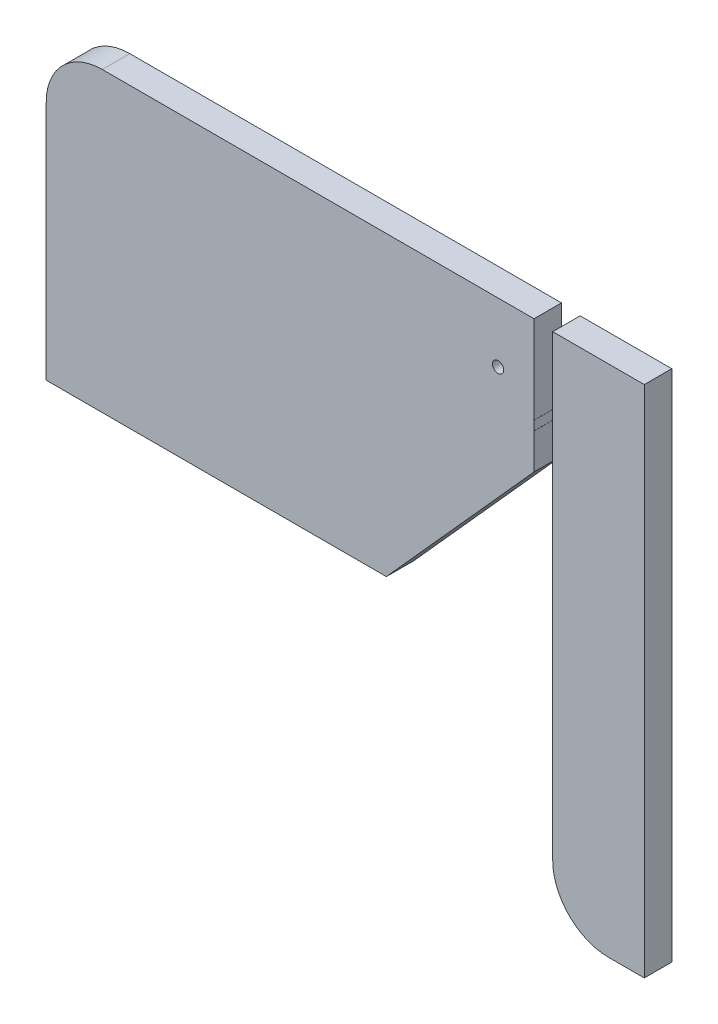
ISO-10303-21;
HEADER;
FILE_DESCRIPTION(('STEP AP214'),'2;1');
FILE_NAME('part.step','',(''),(''),'','','');
FILE_SCHEMA(('AUTOMOTIVE_DESIGN { 1 0 10303 214 1 1 1 1 }'));
ENDSEC;
DATA;
#1=APPLICATION_CONTEXT('core data for automotive mechanical design processes');
#2=APPLICATION_PROTOCOL_DEFINITION('international standard','automotive_design',2000,#1);
#3=PRODUCT_CONTEXT('',#1,'mechanical');
#4=PRODUCT('Part','Part','',(#3));
#5=PRODUCT_RELATED_PRODUCT_CATEGORY('part','',(#4));
#6=PRODUCT_DEFINITION_FORMATION('','',#4);
#7=PRODUCT_DEFINITION_CONTEXT('part definition',#1,'design');
#8=PRODUCT_DEFINITION('design','',#6,#7);
#9=PRODUCT_DEFINITION_SHAPE('','',#8);
#10=(LENGTH_UNIT() NAMED_UNIT(*) SI_UNIT(.MILLI.,.METRE.));
#11=(NAMED_UNIT(*) PLANE_ANGLE_UNIT() SI_UNIT($,.RADIAN.));
#12=(NAMED_UNIT(*) SI_UNIT($,.STERADIAN.) SOLID_ANGLE_UNIT());
#13=UNCERTAINTY_MEASURE_WITH_UNIT(LENGTH_MEASURE(1.E-05),#10,'distance_accuracy_value','');
#14=(GEOMETRIC_REPRESENTATION_CONTEXT(3) GLOBAL_UNCERTAINTY_ASSIGNED_CONTEXT((#13)) GLOBAL_UNIT_ASSIGNED_CONTEXT((#10,
#11,#12)) REPRESENTATION_CONTEXT('',''));
#15=CARTESIAN_POINT('',(0.,0.,0.));
#16=DIRECTION('',(0.,0.,1.));
#17=DIRECTION('',(1.,0.,0.));
#18=AXIS2_PLACEMENT_3D('',#15,#16,#17);
#19=CARTESIAN_POINT('',(27.4,24.1,1.47));
#20=DIRECTION('',(0.,0.,-1.));
#21=DIRECTION('',(-1.,0.,0.));
#22=AXIS2_PLACEMENT_3D('',#19,#20,#21);
#23=CYLINDRICAL_SURFACE('',#22,0.00249999999999903);
#24=CARTESIAN_POINT('',(27.4,24.1,0.));
#25=DIRECTION('',(0.,0.,1.));
#26=DIRECTION('',(1.,0.,0.));
#27=AXIS2_PLACEMENT_3D('',#24,#25,#26);
#28=CIRCLE('',#27,0.00249999999999903);
#29=CARTESIAN_POINT('',(27.4,24.0975,0.));
#30=VERTEX_POINT('',#29);
#31=CARTESIAN_POINT('',(27.4,24.1025,0.));
#32=VERTEX_POINT('',#31);
#33=EDGE_CURVE('E144',#30,#32,#28,.T.);
#34=ORIENTED_EDGE('',*,*,#33,.F.);
#35=DIRECTION('',(0.,0.,-1.));
#36=VECTOR('',#35,1.);
#37=CARTESIAN_POINT('',(27.4,24.0975,1.47));
#38=LINE('',#37,#36);
#39=CARTESIAN_POINT('',(27.4,24.0975,1.47));
#40=VERTEX_POINT('',#39);
#41=EDGE_CURVE('E12',#40,#30,#38,.T.);
#42=ORIENTED_EDGE('',*,*,#41,.F.);
#43=CARTESIAN_POINT('',(27.4,24.1,1.47));
#44=DIRECTION('',(0.,0.,1.));
#45=DIRECTION('',(1.,0.,0.));
#46=AXIS2_PLACEMENT_3D('',#43,#44,#45);
#47=CIRCLE('',#46,0.00249999999999903);
#48=CARTESIAN_POINT('',(27.4,24.1025,1.47));
#49=VERTEX_POINT('',#48);
#50=EDGE_CURVE('E200',#40,#49,#47,.T.);
#51=ORIENTED_EDGE('',*,*,#50,.T.);
#52=DIRECTION('',(0.,0.,-1.));
#53=VECTOR('',#52,1.);
#54=CARTESIAN_POINT('',(27.4,24.1025,1.47));
#55=LINE('',#54,#53);
#56=EDGE_CURVE('E97',#49,#32,#55,.T.);
#57=ORIENTED_EDGE('',*,*,#56,.T.);
#58=EDGE_LOOP('',(#34,#42,#51,#57));
#59=FACE_BOUND('',#58,.T.);
#60=ADVANCED_FACE('F44',(#59),#23,.F.);
#61=CARTESIAN_POINT('',(27.4,0.,1.47));
#62=DIRECTION('',(1.,0.,0.));
#63=DIRECTION('',(0.,0.,-1.));
#64=AXIS2_PLACEMENT_3D('',#61,#62,#63);
#65=PLANE('',#64);
#66=DIRECTION('',(0.,-1.,0.));
#67=VECTOR('',#66,1.);
#68=CARTESIAN_POINT('',(27.4,0.,0.));
#69=LINE('',#68,#67);
#70=CARTESIAN_POINT('',(27.4,4.7,0.));
#71=VERTEX_POINT('',#70);
#72=EDGE_CURVE('E147',#30,#71,#69,.T.);
#73=ORIENTED_EDGE('',*,*,#72,.T.);
#74=DIRECTION('',(0.,0.,-1.));
#75=VECTOR('',#74,1.);
#76=CARTESIAN_POINT('',(27.4,4.7,1.47));
#77=LINE('',#76,#75);
#78=CARTESIAN_POINT('',(27.4,4.7,1.47));
#79=VERTEX_POINT('',#78);
#80=EDGE_CURVE('E52',#79,#71,#77,.T.);
#81=ORIENTED_EDGE('',*,*,#80,.F.);
#82=DIRECTION('',(0.,-1.,0.));
#83=VECTOR('',#82,1.);
#84=CARTESIAN_POINT('',(27.4,0.,1.47));
#85=LINE('',#84,#83);
#86=EDGE_CURVE('E196',#40,#79,#85,.T.);
#87=ORIENTED_EDGE('',*,*,#86,.F.);
#88=ORIENTED_EDGE('',*,*,#41,.T.);
#89=EDGE_LOOP('',(#73,#81,#87,#88));
#90=FACE_BOUND('',#89,.T.);
#91=ADVANCED_FACE('F203',(#90),#65,.F.);
#92=CARTESIAN_POINT('',(30.4,4.7,1.47));
#93=DIRECTION('',(0.,0.,-1.));
#94=DIRECTION('',(-1.,0.,0.));
#95=AXIS2_PLACEMENT_3D('',#92,#93,#94);
#96=CYLINDRICAL_SURFACE('',#95,3.);
#97=CARTESIAN_POINT('',(30.4,4.7,0.));
#98=DIRECTION('',(0.,0.,1.));
#99=DIRECTION('',(1.,0.,0.));
#100=AXIS2_PLACEMENT_3D('',#97,#98,#99);
#101=CIRCLE('',#100,3.);
#102=CARTESIAN_POINT('',(30.4,1.7,0.));
#103=VERTEX_POINT('',#102);
#104=EDGE_CURVE('E149',#71,#103,#101,.T.);
#105=ORIENTED_EDGE('',*,*,#104,.T.);
#106=DIRECTION('',(0.,0.,-1.));
#107=VECTOR('',#106,1.);
#108=CARTESIAN_POINT('',(30.4,1.7,1.47));
#109=LINE('',#108,#107);
#110=CARTESIAN_POINT('',(30.4,1.7,1.47));
#111=VERTEX_POINT('',#110);
#112=EDGE_CURVE('E170',#111,#103,#109,.T.);
#113=ORIENTED_EDGE('',*,*,#112,.F.);
#114=CARTESIAN_POINT('',(30.4,4.7,1.47));
#115=DIRECTION('',(0.,0.,1.));
#116=DIRECTION('',(1.,0.,0.));
#117=AXIS2_PLACEMENT_3D('',#114,#115,#116);
#118=CIRCLE('',#117,3.);
#119=EDGE_CURVE('E179',#79,#111,#118,.T.);
#120=ORIENTED_EDGE('',*,*,#119,.F.);
#121=ORIENTED_EDGE('',*,*,#80,.T.);
#122=EDGE_LOOP('',(#105,#113,#120,#121));
#123=FACE_BOUND('',#122,.T.);
#124=ADVANCED_FACE('F177',(#123),#96,.T.);
#125=CARTESIAN_POINT('',(0.,1.7,1.47));
#126=DIRECTION('',(0.,1.,0.));
#127=DIRECTION('',(0.,0.,1.));
#128=AXIS2_PLACEMENT_3D('',#125,#126,#127);
#129=PLANE('',#128);
#130=DIRECTION('',(1.,0.,0.));
#131=VECTOR('',#130,1.);
#132=CARTESIAN_POINT('',(0.,1.7,0.));
#133=LINE('',#132,#131);
#134=CARTESIAN_POINT('',(32.3,1.7,0.));
#135=VERTEX_POINT('',#134);
#136=EDGE_CURVE('E151',#103,#135,#133,.T.);
#137=ORIENTED_EDGE('',*,*,#136,.T.);
#138=DIRECTION('',(0.,0.,-1.));
#139=VECTOR('',#138,1.);
#140=CARTESIAN_POINT('',(32.3,1.7,1.47));
#141=LINE('',#140,#139);
#142=CARTESIAN_POINT('',(32.3,1.7,1.47));
#143=VERTEX_POINT('',#142);
#144=EDGE_CURVE('E168',#143,#135,#141,.T.);
#145=ORIENTED_EDGE('',*,*,#144,.F.);
#146=DIRECTION('',(1.,0.,0.));
#147=VECTOR('',#146,1.);
#148=CARTESIAN_POINT('',(0.,1.7,1.47));
#149=LINE('',#148,#147);
#150=EDGE_CURVE('E192',#111,#143,#149,.T.);
#151=ORIENTED_EDGE('',*,*,#150,.F.);
#152=ORIENTED_EDGE('',*,*,#112,.T.);
#153=EDGE_LOOP('',(#137,#145,#151,#152));
#154=FACE_BOUND('',#153,.T.);
#155=ADVANCED_FACE('F189',(#154),#129,.F.);
#156=CARTESIAN_POINT('',(32.3,0.,1.47));
#157=DIRECTION('',(1.,0.,0.));
#158=DIRECTION('',(0.,0.,-1.));
#159=AXIS2_PLACEMENT_3D('',#156,#157,#158);
#160=PLANE('',#159);
#161=DIRECTION('',(0.,-1.,0.));
#162=VECTOR('',#161,1.);
#163=CARTESIAN_POINT('',(32.3,0.,0.));
#164=LINE('',#163,#162);
#165=CARTESIAN_POINT('',(32.3,29.2,0.));
#166=VERTEX_POINT('',#165);
#167=EDGE_CURVE('E154',#166,#135,#164,.T.);
#168=ORIENTED_EDGE('',*,*,#167,.F.);
#169=DIRECTION('',(0.,0.,-1.));
#170=VECTOR('',#169,1.);
#171=CARTESIAN_POINT('',(32.3,29.2,1.47));
#172=LINE('',#171,#170);
#173=CARTESIAN_POINT('',(32.3,29.2,1.47));
#174=VERTEX_POINT('',#173);
#175=EDGE_CURVE('E166',#174,#166,#172,.T.);
#176=ORIENTED_EDGE('',*,*,#175,.F.);
#177=DIRECTION('',(0.,-1.,0.));
#178=VECTOR('',#177,1.);
#179=CARTESIAN_POINT('',(32.3,0.,1.47));
#180=LINE('',#179,#178);
#181=EDGE_CURVE('E193',#174,#143,#180,.T.);
#182=ORIENTED_EDGE('',*,*,#181,.T.);
#183=ORIENTED_EDGE('',*,*,#144,.T.);
#184=EDGE_LOOP('',(#168,#176,#182,#183));
#185=FACE_BOUND('',#184,.T.);
#186=ADVANCED_FACE('F214',(#185),#160,.T.);
#187=CARTESIAN_POINT('',(0.,29.2,1.47));
#188=DIRECTION('',(0.,-1.,0.));
#189=DIRECTION('',(0.,0.,-1.));
#190=AXIS2_PLACEMENT_3D('',#187,#188,#189);
#191=PLANE('',#190);
#192=DIRECTION('',(-1.,0.,0.));
#193=VECTOR('',#192,1.);
#194=CARTESIAN_POINT('',(0.,29.2,0.));
#195=LINE('',#194,#193);
#196=CARTESIAN_POINT('',(27.4,29.2,0.));
#197=VERTEX_POINT('',#196);
#198=EDGE_CURVE('E157',#166,#197,#195,.T.);
#199=ORIENTED_EDGE('',*,*,#198,.T.);
#200=DIRECTION('',(0.,0.,-1.));
#201=VECTOR('',#200,1.);
#202=CARTESIAN_POINT('',(27.4,29.2,1.47));
#203=LINE('',#202,#201);
#204=CARTESIAN_POINT('',(27.4,29.2,1.47));
#205=VERTEX_POINT('',#204);
#206=EDGE_CURVE('E138',#205,#197,#203,.T.);
#207=ORIENTED_EDGE('',*,*,#206,.F.);
#208=DIRECTION('',(-1.,0.,0.));
#209=VECTOR('',#208,1.);
#210=CARTESIAN_POINT('',(0.,29.2,1.47));
#211=LINE('',#210,#209);
#212=EDGE_CURVE('E125',#174,#205,#211,.T.);
#213=ORIENTED_EDGE('',*,*,#212,.F.);
#214=ORIENTED_EDGE('',*,*,#175,.T.);
#215=EDGE_LOOP('',(#199,#207,#213,#214));
#216=FACE_BOUND('',#215,.T.);
#217=ADVANCED_FACE('F217',(#216),#191,.F.);
#218=CARTESIAN_POINT('',(27.4,0.,1.47));
#219=DIRECTION('',(1.,0.,0.));
#220=DIRECTION('',(0.,0.,-1.));
#221=AXIS2_PLACEMENT_3D('',#218,#219,#220);
#222=PLANE('',#221);
#223=DIRECTION('',(0.,-1.,0.));
#224=VECTOR('',#223,1.);
#225=CARTESIAN_POINT('',(27.4,0.,0.));
#226=LINE('',#225,#224);
#227=CARTESIAN_POINT('',(27.4,24.6025,0.));
#228=VERTEX_POINT('',#227);
#229=EDGE_CURVE('E134',#197,#228,#226,.T.);
#230=ORIENTED_EDGE('',*,*,#229,.T.);
#231=DIRECTION('',(0.,0.,-1.));
#232=VECTOR('',#231,1.);
#233=CARTESIAN_POINT('',(27.4,24.6025,1.47));
#234=LINE('',#233,#232);
#235=CARTESIAN_POINT('',(27.4,24.6025,1.47));
#236=VERTEX_POINT('',#235);
#237=EDGE_CURVE('E131',#236,#228,#234,.T.);
#238=ORIENTED_EDGE('',*,*,#237,.F.);
#239=DIRECTION('',(0.,-1.,0.));
#240=VECTOR('',#239,1.);
#241=CARTESIAN_POINT('',(27.4,0.,1.47));
#242=LINE('',#241,#240);
#243=EDGE_CURVE('E118',#205,#236,#242,.T.);
#244=ORIENTED_EDGE('',*,*,#243,.F.);
#245=ORIENTED_EDGE('',*,*,#206,.T.);
#246=EDGE_LOOP('',(#230,#238,#244,#245));
#247=FACE_BOUND('',#246,.T.);
#248=ADVANCED_FACE('F132',(#247),#222,.F.);
#249=CARTESIAN_POINT('',(27.4,24.6,1.47));
#250=DIRECTION('',(0.,0.,-1.));
#251=DIRECTION('',(-1.,0.,0.));
#252=AXIS2_PLACEMENT_3D('',#249,#250,#251);
#253=CYLINDRICAL_SURFACE('',#252,0.00249999999999903);
#254=CARTESIAN_POINT('',(27.4,24.6,0.));
#255=DIRECTION('',(0.,0.,1.));
#256=DIRECTION('',(1.,0.,0.));
#257=AXIS2_PLACEMENT_3D('',#254,#255,#256);
#258=CIRCLE('',#257,0.00249999999999903);
#259=CARTESIAN_POINT('',(27.4,24.5975,0.));
#260=VERTEX_POINT('',#259);
#261=EDGE_CURVE('E160',#260,#228,#258,.T.);
#262=ORIENTED_EDGE('',*,*,#261,.F.);
#263=DIRECTION('',(0.,0.,-1.));
#264=VECTOR('',#263,1.);
#265=CARTESIAN_POINT('',(27.4,24.5975,1.47));
#266=LINE('',#265,#264);
#267=CARTESIAN_POINT('',(27.4,24.5975,1.47));
#268=VERTEX_POINT('',#267);
#269=EDGE_CURVE('E90',#268,#260,#266,.T.);
#270=ORIENTED_EDGE('',*,*,#269,.F.);
#271=CARTESIAN_POINT('',(27.4,24.6,1.47));
#272=DIRECTION('',(0.,0.,1.));
#273=DIRECTION('',(1.,0.,0.));
#274=AXIS2_PLACEMENT_3D('',#271,#272,#273);
#275=CIRCLE('',#274,0.00249999999999903);
#276=EDGE_CURVE('E122',#268,#236,#275,.T.);
#277=ORIENTED_EDGE('',*,*,#276,.T.);
#278=ORIENTED_EDGE('',*,*,#237,.T.);
#279=EDGE_LOOP('',(#262,#270,#277,#278));
#280=FACE_BOUND('',#279,.T.);
#281=ADVANCED_FACE('F140',(#280),#253,.F.);
#282=EDGE_CURVE('E161',#260,#32,#226,.T.);
#283=ORIENTED_EDGE('',*,*,#282,.T.);
#284=ORIENTED_EDGE('',*,*,#56,.F.);
#285=EDGE_CURVE('E60',#268,#49,#242,.T.);
#286=ORIENTED_EDGE('',*,*,#285,.F.);
#287=ORIENTED_EDGE('',*,*,#269,.T.);
#288=EDGE_LOOP('',(#283,#284,#286,#287));
#289=FACE_BOUND('',#288,.T.);
#290=ADVANCED_FACE('F201',(#289),#222,.F.);
#291=CARTESIAN_POINT('',(0.,0.,1.47));
#292=DIRECTION('',(0.,0.,1.));
#293=DIRECTION('',(1.,0.,0.));
#294=AXIS2_PLACEMENT_3D('',#291,#292,#293);
#295=PLANE('',#294);
#296=ORIENTED_EDGE('',*,*,#50,.F.);
#297=ORIENTED_EDGE('',*,*,#86,.T.);
#298=ORIENTED_EDGE('',*,*,#119,.T.);
#299=ORIENTED_EDGE('',*,*,#150,.T.);
#300=ORIENTED_EDGE('',*,*,#181,.F.);
#301=ORIENTED_EDGE('',*,*,#212,.T.);
#302=ORIENTED_EDGE('',*,*,#243,.T.);
#303=ORIENTED_EDGE('',*,*,#276,.F.);
#304=ORIENTED_EDGE('',*,*,#285,.T.);
#305=EDGE_LOOP('',(#296,#297,#298,#299,#300,#301,#302,#303,#304));
#306=FACE_BOUND('',#305,.T.);
#307=ADVANCED_FACE('F120',(#306),#295,.T.);
#308=CARTESIAN_POINT('',(0.,0.,0.));
#309=DIRECTION('',(0.,0.,1.));
#310=DIRECTION('',(1.,0.,0.));
#311=AXIS2_PLACEMENT_3D('',#308,#309,#310);
#312=PLANE('',#311);
#313=ORIENTED_EDGE('',*,*,#33,.T.);
#314=ORIENTED_EDGE('',*,*,#282,.F.);
#315=ORIENTED_EDGE('',*,*,#261,.T.);
#316=ORIENTED_EDGE('',*,*,#229,.F.);
#317=ORIENTED_EDGE('',*,*,#198,.F.);
#318=ORIENTED_EDGE('',*,*,#167,.T.);
#319=ORIENTED_EDGE('',*,*,#136,.F.);
#320=ORIENTED_EDGE('',*,*,#104,.F.);
#321=ORIENTED_EDGE('',*,*,#72,.F.);
#322=EDGE_LOOP('',(#313,#314,#315,#316,#317,#318,#319,#320,#321));
#323=FACE_BOUND('',#322,.T.);
#324=ADVANCED_FACE('F184',(#323),#312,.F.);
#325=CLOSED_SHELL('',(#60,#91,#124,#155,#186,#217,#248,#281,#290,#307,#324));
#326=MANIFOLD_SOLID_BREP('B2',#325);
#327=CARTESIAN_POINT('',(17.69985,13.4,1.47));
#328=DIRECTION('',(0.,0.,-1.));
#329=DIRECTION('',(-1.,0.,0.));
#330=AXIS2_PLACEMENT_3D('',#327,#328,#329);
#331=CYLINDRICAL_SURFACE('',#330,0.000150000000000844);
#332=CARTESIAN_POINT('',(17.69985,13.4,0.));
#333=DIRECTION('',(0.,0.,1.));
#334=DIRECTION('',(1.,0.,0.));
#335=AXIS2_PLACEMENT_3D('',#332,#333,#334);
#336=CIRCLE('',#335,0.000150000000000844);
#337=CARTESIAN_POINT('',(17.7,13.4,0.));
#338=VERTEX_POINT('',#337);
#339=CARTESIAN_POINT('',(17.6997,13.4,0.));
#340=VERTEX_POINT('',#339);
#341=EDGE_CURVE('E429',#338,#340,#336,.T.);
#342=ORIENTED_EDGE('',*,*,#341,.F.);
#343=DIRECTION('',(0.,0.,-1.));
#344=VECTOR('',#343,1.);
#345=CARTESIAN_POINT('',(17.7,13.4,1.47));
#346=LINE('',#345,#344);
#347=CARTESIAN_POINT('',(17.7,13.4,1.47));
#348=VERTEX_POINT('',#347);
#349=EDGE_CURVE('E42',#348,#338,#346,.T.);
#350=ORIENTED_EDGE('',*,*,#349,.F.);
#351=CARTESIAN_POINT('',(17.69985,13.4,1.47));
#352=DIRECTION('',(0.,0.,1.));
#353=DIRECTION('',(1.,0.,0.));
#354=AXIS2_PLACEMENT_3D('',#351,#352,#353);
#355=CIRCLE('',#354,0.000150000000000844);
#356=CARTESIAN_POINT('',(17.6997,13.4,1.47));
#357=VERTEX_POINT('',#356);
#358=EDGE_CURVE('E467',#348,#357,#355,.T.);
#359=ORIENTED_EDGE('',*,*,#358,.T.);
#360=DIRECTION('',(0.,0.,-1.));
#361=VECTOR('',#360,1.);
#362=CARTESIAN_POINT('',(17.6997,13.4,1.47));
#363=LINE('',#362,#361);
#364=EDGE_CURVE('E313',#357,#340,#363,.T.);
#365=ORIENTED_EDGE('',*,*,#364,.T.);
#366=EDGE_LOOP('',(#342,#350,#359,#365));
#367=FACE_BOUND('',#366,.T.);
#368=ADVANCED_FACE('F297',(#367),#331,.F.);
#369=CARTESIAN_POINT('',(0.,13.4,1.47));
#370=DIRECTION('',(0.,-1.,0.));
#371=DIRECTION('',(0.,0.,-1.));
#372=AXIS2_PLACEMENT_3D('',#369,#370,#371);
#373=PLANE('',#372);
#374=DIRECTION('',(-1.,0.,0.));
#375=VECTOR('',#374,1.);
#376=CARTESIAN_POINT('',(0.,13.4,0.));
#377=LINE('',#376,#375);
#378=CARTESIAN_POINT('',(18.1997,13.4,0.));
#379=VERTEX_POINT('',#378);
#380=EDGE_CURVE('E431',#379,#338,#377,.T.);
#381=ORIENTED_EDGE('',*,*,#380,.F.);
#382=DIRECTION('',(0.,0.,-1.));
#383=VECTOR('',#382,1.);
#384=CARTESIAN_POINT('',(18.1997,13.4,1.47));
#385=LINE('',#384,#383);
#386=CARTESIAN_POINT('',(18.1997,13.4,1.47));
#387=VERTEX_POINT('',#386);
#388=EDGE_CURVE('E305',#387,#379,#385,.T.);
#389=ORIENTED_EDGE('',*,*,#388,.F.);
#390=DIRECTION('',(-1.,0.,0.));
#391=VECTOR('',#390,1.);
#392=CARTESIAN_POINT('',(0.,13.4,1.47));
#393=LINE('',#392,#391);
#394=EDGE_CURVE('E510',#387,#348,#393,.T.);
#395=ORIENTED_EDGE('',*,*,#394,.T.);
#396=ORIENTED_EDGE('',*,*,#349,.T.);
#397=EDGE_LOOP('',(#381,#389,#395,#396));
#398=FACE_BOUND('',#397,.T.);
#399=ADVANCED_FACE('F497',(#398),#373,.T.);
#400=CARTESIAN_POINT('',(18.19985,13.4,1.47));
#401=DIRECTION('',(0.,0.,-1.));
#402=DIRECTION('',(-1.,0.,0.));
#403=AXIS2_PLACEMENT_3D('',#400,#401,#402);
#404=CYLINDRICAL_SURFACE('',#403,0.000150000000000844);
#405=CARTESIAN_POINT('',(18.19985,13.4,0.));
#406=DIRECTION('',(0.,0.,1.));
#407=DIRECTION('',(1.,0.,0.));
#408=AXIS2_PLACEMENT_3D('',#405,#406,#407);
#409=CIRCLE('',#408,0.000150000000000844);
#410=CARTESIAN_POINT('',(18.2,13.4,0.));
#411=VERTEX_POINT('',#410);
#412=EDGE_CURVE('E434',#411,#379,#409,.T.);
#413=ORIENTED_EDGE('',*,*,#412,.F.);
#414=DIRECTION('',(0.,0.,-1.));
#415=VECTOR('',#414,1.);
#416=CARTESIAN_POINT('',(18.2,13.4,1.47));
#417=LINE('',#416,#415);
#418=CARTESIAN_POINT('',(18.2,13.4,1.47));
#419=VERTEX_POINT('',#418);
#420=EDGE_CURVE('E486',#419,#411,#417,.T.);
#421=ORIENTED_EDGE('',*,*,#420,.F.);
#422=CARTESIAN_POINT('',(18.19985,13.4,1.47));
#423=DIRECTION('',(0.,0.,1.));
#424=DIRECTION('',(1.,0.,0.));
#425=AXIS2_PLACEMENT_3D('',#422,#423,#424);
#426=CIRCLE('',#425,0.000150000000000844);
#427=EDGE_CURVE('E493',#419,#387,#426,.T.);
#428=ORIENTED_EDGE('',*,*,#427,.T.);
#429=ORIENTED_EDGE('',*,*,#388,.T.);
#430=EDGE_LOOP('',(#413,#421,#428,#429));
#431=FACE_BOUND('',#430,.T.);
#432=ADVANCED_FACE('F491',(#431),#404,.F.);
#433=CARTESIAN_POINT('',(0.,13.4,1.47));
#434=DIRECTION('',(0.,-1.,0.));
#435=DIRECTION('',(0.,0.,-1.));
#436=AXIS2_PLACEMENT_3D('',#433,#434,#435);
#437=PLANE('',#436);
#438=DIRECTION('',(-1.,0.,0.));
#439=VECTOR('',#438,1.);
#440=CARTESIAN_POINT('',(0.,13.4,0.));
#441=LINE('',#440,#439);
#442=CARTESIAN_POINT('',(18.5,13.4,0.));
#443=VERTEX_POINT('',#442);
#444=EDGE_CURVE('E437',#443,#411,#441,.T.);
#445=ORIENTED_EDGE('',*,*,#444,.F.);
#446=DIRECTION('',(0.,0.,-1.));
#447=VECTOR('',#446,1.);
#448=CARTESIAN_POINT('',(18.5,13.4,1.47));
#449=LINE('',#448,#447);
#450=CARTESIAN_POINT('',(18.5,13.4,1.47));
#451=VERTEX_POINT('',#450);
#452=EDGE_CURVE('E484',#451,#443,#449,.T.);
#453=ORIENTED_EDGE('',*,*,#452,.F.);
#454=DIRECTION('',(-1.,0.,0.));
#455=VECTOR('',#454,1.);
#456=CARTESIAN_POINT('',(0.,13.4,1.47));
#457=LINE('',#456,#455);
#458=EDGE_CURVE('E509',#451,#419,#457,.T.);
#459=ORIENTED_EDGE('',*,*,#458,.T.);
#460=ORIENTED_EDGE('',*,*,#420,.T.);
#461=EDGE_LOOP('',(#445,#453,#459,#460));
#462=FACE_BOUND('',#461,.T.);
#463=ADVANCED_FACE('F505',(#462),#437,.T.);
#464=CARTESIAN_POINT('',(3.58292456203075,-3.21648909545942,1.47));
#465=DIRECTION('',(-0.744134494477024,0.668029830269146,0.));
#466=DIRECTION('',(-0.668029830269146,-0.744134494477024,0.));
#467=AXIS2_PLACEMENT_3D('',#464,#465,#466);
#468=PLANE('',#467);
#469=DIRECTION('',(0.668029830269146,0.744134494477024,0.));
#470=VECTOR('',#469,1.);
#471=CARTESIAN_POINT('',(3.58292456203075,-3.21648909545942,0.));
#472=LINE('',#471,#470);
#473=CARTESIAN_POINT('',(26.4,22.2,0.));
#474=VERTEX_POINT('',#473);
#475=EDGE_CURVE('E440',#443,#474,#472,.T.);
#476=ORIENTED_EDGE('',*,*,#475,.T.);
#477=DIRECTION('',(0.,0.,-1.));
#478=VECTOR('',#477,1.);
#479=CARTESIAN_POINT('',(26.4,22.2,1.47));
#480=LINE('',#479,#478);
#481=CARTESIAN_POINT('',(26.4,22.2,1.47));
#482=VERTEX_POINT('',#481);
#483=EDGE_CURVE('E481',#482,#474,#480,.T.);
#484=ORIENTED_EDGE('',*,*,#483,.F.);
#485=DIRECTION('',(0.668029830269146,0.744134494477024,0.));
#486=VECTOR('',#485,1.);
#487=CARTESIAN_POINT('',(3.58292456203075,-3.21648909545942,1.47));
#488=LINE('',#487,#486);
#489=EDGE_CURVE('E512',#451,#482,#488,.T.);
#490=ORIENTED_EDGE('',*,*,#489,.F.);
#491=ORIENTED_EDGE('',*,*,#452,.T.);
#492=EDGE_LOOP('',(#476,#484,#490,#491));
#493=FACE_BOUND('',#492,.T.);
#494=ADVANCED_FACE('F561',(#493),#468,.F.);
#495=CARTESIAN_POINT('',(26.4,0.,1.47));
#496=DIRECTION('',(-1.,0.,0.));
#497=DIRECTION('',(0.,0.,1.));
#498=AXIS2_PLACEMENT_3D('',#495,#496,#497);
#499=PLANE('',#498);
#500=DIRECTION('',(0.,1.,0.));
#501=VECTOR('',#500,1.);
#502=CARTESIAN_POINT('',(26.4,0.,0.));
#503=LINE('',#502,#501);
#504=CARTESIAN_POINT('',(26.4,24.0975,0.));
#505=VERTEX_POINT('',#504);
#506=EDGE_CURVE('E442',#474,#505,#503,.T.);
#507=ORIENTED_EDGE('',*,*,#506,.T.);
#508=DIRECTION('',(0.,0.,-1.));
#509=VECTOR('',#508,1.);
#510=CARTESIAN_POINT('',(26.4,24.0975,1.47));
#511=LINE('',#510,#509);
#512=CARTESIAN_POINT('',(26.4,24.0975,1.47));
#513=VERTEX_POINT('',#512);
#514=EDGE_CURVE('E479',#513,#505,#511,.T.);
#515=ORIENTED_EDGE('',*,*,#514,.F.);
#516=DIRECTION('',(0.,1.,0.));
#517=VECTOR('',#516,1.);
#518=CARTESIAN_POINT('',(26.4,0.,1.47));
#519=LINE('',#518,#517);
#520=EDGE_CURVE('E518',#482,#513,#519,.T.);
#521=ORIENTED_EDGE('',*,*,#520,.F.);
#522=ORIENTED_EDGE('',*,*,#483,.T.);
#523=EDGE_LOOP('',(#507,#515,#521,#522));
#524=FACE_BOUND('',#523,.T.);
#525=ADVANCED_FACE('F564',(#524),#499,.F.);
#526=CARTESIAN_POINT('',(26.4,24.1,1.47));
#527=DIRECTION('',(0.,0.,-1.));
#528=DIRECTION('',(-1.,0.,0.));
#529=AXIS2_PLACEMENT_3D('',#526,#527,#528);
#530=CYLINDRICAL_SURFACE('',#529,0.00249999999999903);
#531=CARTESIAN_POINT('',(26.4,24.1,0.));
#532=DIRECTION('',(0.,0.,1.));
#533=DIRECTION('',(1.,0.,0.));
#534=AXIS2_PLACEMENT_3D('',#531,#532,#533);
#535=CIRCLE('',#534,0.00249999999999903);
#536=CARTESIAN_POINT('',(26.4,24.1025,0.));
#537=VERTEX_POINT('',#536);
#538=EDGE_CURVE('E445',#537,#505,#535,.T.);
#539=ORIENTED_EDGE('',*,*,#538,.F.);
#540=DIRECTION('',(0.,0.,-1.));
#541=VECTOR('',#540,1.);
#542=CARTESIAN_POINT('',(26.4,24.1025,1.47));
#543=LINE('',#542,#541);
#544=CARTESIAN_POINT('',(26.4,24.1025,1.47));
#545=VERTEX_POINT('',#544);
#546=EDGE_CURVE('E477',#545,#537,#543,.T.);
#547=ORIENTED_EDGE('',*,*,#546,.F.);
#548=CARTESIAN_POINT('',(26.4,24.1,1.47));
#549=DIRECTION('',(0.,0.,1.));
#550=DIRECTION('',(1.,0.,0.));
#551=AXIS2_PLACEMENT_3D('',#548,#549,#550);
#552=CIRCLE('',#551,0.00249999999999903);
#553=EDGE_CURVE('E520',#545,#513,#552,.T.);
#554=ORIENTED_EDGE('',*,*,#553,.T.);
#555=ORIENTED_EDGE('',*,*,#514,.T.);
#556=EDGE_LOOP('',(#539,#547,#554,#555));
#557=FACE_BOUND('',#556,.T.);
#558=ADVANCED_FACE('F568',(#557),#530,.F.);
#559=CARTESIAN_POINT('',(26.4,0.,1.47));
#560=DIRECTION('',(-1.,0.,0.));
#561=DIRECTION('',(0.,0.,1.));
#562=AXIS2_PLACEMENT_3D('',#559,#560,#561);
#563=PLANE('',#562);
#564=DIRECTION('',(0.,1.,0.));
#565=VECTOR('',#564,1.);
#566=CARTESIAN_POINT('',(26.4,0.,0.));
#567=LINE('',#566,#565);
#568=CARTESIAN_POINT('',(26.4,24.5975,0.));
#569=VERTEX_POINT('',#568);
#570=EDGE_CURVE('E448',#537,#569,#567,.T.);
#571=ORIENTED_EDGE('',*,*,#570,.T.);
#572=DIRECTION('',(0.,0.,-1.));
#573=VECTOR('',#572,1.);
#574=CARTESIAN_POINT('',(26.4,24.5975,1.47));
#575=LINE('',#574,#573);
#576=CARTESIAN_POINT('',(26.4,24.5975,1.47));
#577=VERTEX_POINT('',#576);
#578=EDGE_CURVE('E475',#577,#569,#575,.T.);
#579=ORIENTED_EDGE('',*,*,#578,.F.);
#580=DIRECTION('',(0.,1.,0.));
#581=VECTOR('',#580,1.);
#582=CARTESIAN_POINT('',(26.4,0.,1.47));
#583=LINE('',#582,#581);
#584=EDGE_CURVE('E523',#545,#577,#583,.T.);
#585=ORIENTED_EDGE('',*,*,#584,.F.);
#586=ORIENTED_EDGE('',*,*,#546,.T.);
#587=EDGE_LOOP('',(#571,#579,#585,#586));
#588=FACE_BOUND('',#587,.T.);
#589=ADVANCED_FACE('F572',(#588),#563,.F.);
#590=CARTESIAN_POINT('',(26.4,24.6,1.47));
#591=DIRECTION('',(0.,0.,-1.));
#592=DIRECTION('',(-1.,0.,0.));
#593=AXIS2_PLACEMENT_3D('',#590,#591,#592);
#594=CYLINDRICAL_SURFACE('',#593,0.00249999999999903);
#595=CARTESIAN_POINT('',(26.4,24.6,0.));
#596=DIRECTION('',(0.,0.,1.));
#597=DIRECTION('',(1.,0.,0.));
#598=AXIS2_PLACEMENT_3D('',#595,#596,#597);
#599=CIRCLE('',#598,0.00249999999999903);
#600=CARTESIAN_POINT('',(26.4,24.6025,0.));
#601=VERTEX_POINT('',#600);
#602=EDGE_CURVE('E451',#601,#569,#599,.T.);
#603=ORIENTED_EDGE('',*,*,#602,.F.);
#604=DIRECTION('',(0.,0.,-1.));
#605=VECTOR('',#604,1.);
#606=CARTESIAN_POINT('',(26.4,24.6025,1.47));
#607=LINE('',#606,#605);
#608=CARTESIAN_POINT('',(26.4,24.6025,1.47));
#609=VERTEX_POINT('',#608);
#610=EDGE_CURVE('E473',#609,#601,#607,.T.);
#611=ORIENTED_EDGE('',*,*,#610,.F.);
#612=CARTESIAN_POINT('',(26.4,24.6,1.47));
#613=DIRECTION('',(0.,0.,1.));
#614=DIRECTION('',(1.,0.,0.));
#615=AXIS2_PLACEMENT_3D('',#612,#613,#614);
#616=CIRCLE('',#615,0.00249999999999903);
#617=EDGE_CURVE('E525',#609,#577,#616,.T.);
#618=ORIENTED_EDGE('',*,*,#617,.T.);
#619=ORIENTED_EDGE('',*,*,#578,.T.);
#620=EDGE_LOOP('',(#603,#611,#618,#619));
#621=FACE_BOUND('',#620,.T.);
#622=ADVANCED_FACE('F574',(#621),#594,.F.);
#623=CARTESIAN_POINT('',(26.4,29.3,0.));
#624=VERTEX_POINT('',#623);
#625=EDGE_CURVE('E452',#601,#624,#567,.T.);
#626=ORIENTED_EDGE('',*,*,#625,.T.);
#627=DIRECTION('',(0.,0.,-1.));
#628=VECTOR('',#627,1.);
#629=CARTESIAN_POINT('',(26.4,29.3,1.47));
#630=LINE('',#629,#628);
#631=CARTESIAN_POINT('',(26.4,29.3,1.47));
#632=VERTEX_POINT('',#631);
#633=EDGE_CURVE('E471',#632,#624,#630,.T.);
#634=ORIENTED_EDGE('',*,*,#633,.F.);
#635=EDGE_CURVE('E526',#609,#632,#583,.T.);
#636=ORIENTED_EDGE('',*,*,#635,.F.);
#637=ORIENTED_EDGE('',*,*,#610,.T.);
#638=EDGE_LOOP('',(#626,#634,#636,#637));
#639=FACE_BOUND('',#638,.T.);
#640=ADVANCED_FACE('F534',(#639),#563,.F.);
#641=CARTESIAN_POINT('',(0.,29.3,1.47));
#642=DIRECTION('',(0.,1.,0.));
#643=DIRECTION('',(0.,0.,1.));
#644=AXIS2_PLACEMENT_3D('',#641,#642,#643);
#645=PLANE('',#644);
#646=DIRECTION('',(1.,0.,0.));
#647=VECTOR('',#646,1.);
#648=CARTESIAN_POINT('',(0.,29.3,0.));
#649=LINE('',#648,#647);
#650=CARTESIAN_POINT('',(3.3,29.3,0.));
#651=VERTEX_POINT('',#650);
#652=EDGE_CURVE('E455',#651,#624,#649,.T.);
#653=ORIENTED_EDGE('',*,*,#652,.F.);
#654=DIRECTION('',(0.,0.,-1.));
#655=VECTOR('',#654,1.);
#656=CARTESIAN_POINT('',(3.3,29.3,1.47));
#657=LINE('',#656,#655);
#658=CARTESIAN_POINT('',(3.3,29.3,1.47));
#659=VERTEX_POINT('',#658);
#660=EDGE_CURVE('E418',#659,#651,#657,.T.);
#661=ORIENTED_EDGE('',*,*,#660,.F.);
#662=DIRECTION('',(1.,0.,0.));
#663=VECTOR('',#662,1.);
#664=CARTESIAN_POINT('',(0.,29.3,1.47));
#665=LINE('',#664,#663);
#666=EDGE_CURVE('E408',#659,#632,#665,.T.);
#667=ORIENTED_EDGE('',*,*,#666,.T.);
#668=ORIENTED_EDGE('',*,*,#633,.T.);
#669=EDGE_LOOP('',(#653,#661,#667,#668));
#670=FACE_BOUND('',#669,.T.);
#671=ADVANCED_FACE('F537',(#670),#645,.T.);
#672=CARTESIAN_POINT('',(3.3,26.3,1.47));
#673=DIRECTION('',(0.,0.,-1.));
#674=DIRECTION('',(-1.,0.,0.));
#675=AXIS2_PLACEMENT_3D('',#672,#673,#674);
#676=CYLINDRICAL_SURFACE('',#675,3.);
#677=CARTESIAN_POINT('',(3.3,26.3,0.));
#678=DIRECTION('',(0.,0.,1.));
#679=DIRECTION('',(1.,0.,0.));
#680=AXIS2_PLACEMENT_3D('',#677,#678,#679);
#681=CIRCLE('',#680,3.);
#682=CARTESIAN_POINT('',(0.3,26.3,0.));
#683=VERTEX_POINT('',#682);
#684=EDGE_CURVE('E415',#651,#683,#681,.T.);
#685=ORIENTED_EDGE('',*,*,#684,.T.);
#686=DIRECTION('',(0.,0.,-1.));
#687=VECTOR('',#686,1.);
#688=CARTESIAN_POINT('',(0.3,26.3,1.47));
#689=LINE('',#688,#687);
#690=CARTESIAN_POINT('',(0.3,26.3,1.47));
#691=VERTEX_POINT('',#690);
#692=EDGE_CURVE('E412',#691,#683,#689,.T.);
#693=ORIENTED_EDGE('',*,*,#692,.F.);
#694=CARTESIAN_POINT('',(3.3,26.3,1.47));
#695=DIRECTION('',(0.,0.,1.));
#696=DIRECTION('',(1.,0.,0.));
#697=AXIS2_PLACEMENT_3D('',#694,#695,#696);
#698=CIRCLE('',#697,3.);
#699=EDGE_CURVE('E400',#659,#691,#698,.T.);
#700=ORIENTED_EDGE('',*,*,#699,.F.);
#701=ORIENTED_EDGE('',*,*,#660,.T.);
#702=EDGE_LOOP('',(#685,#693,#700,#701));
#703=FACE_BOUND('',#702,.T.);
#704=ADVANCED_FACE('F413',(#703),#676,.T.);
#705=CARTESIAN_POINT('',(0.3,0.,1.47));
#706=DIRECTION('',(-1.,0.,0.));
#707=DIRECTION('',(0.,0.,1.));
#708=AXIS2_PLACEMENT_3D('',#705,#706,#707);
#709=PLANE('',#708);
#710=DIRECTION('',(0.,1.,0.));
#711=VECTOR('',#710,1.);
#712=CARTESIAN_POINT('',(0.3,0.,0.));
#713=LINE('',#712,#711);
#714=CARTESIAN_POINT('',(0.3,13.4,0.));
#715=VERTEX_POINT('',#714);
#716=EDGE_CURVE('E459',#715,#683,#713,.T.);
#717=ORIENTED_EDGE('',*,*,#716,.F.);
#718=DIRECTION('',(0.,0.,-1.));
#719=VECTOR('',#718,1.);
#720=CARTESIAN_POINT('',(0.3,13.4,1.47));
#721=LINE('',#720,#719);
#722=CARTESIAN_POINT('',(0.3,13.4,1.47));
#723=VERTEX_POINT('',#722);
#724=EDGE_CURVE('E356',#723,#715,#721,.T.);
#725=ORIENTED_EDGE('',*,*,#724,.F.);
#726=DIRECTION('',(0.,1.,0.));
#727=VECTOR('',#726,1.);
#728=CARTESIAN_POINT('',(0.3,0.,1.47));
#729=LINE('',#728,#727);
#730=EDGE_CURVE('E406',#723,#691,#729,.T.);
#731=ORIENTED_EDGE('',*,*,#730,.T.);
#732=ORIENTED_EDGE('',*,*,#692,.T.);
#733=EDGE_LOOP('',(#717,#725,#731,#732));
#734=FACE_BOUND('',#733,.T.);
#735=ADVANCED_FACE('F420',(#734),#709,.T.);
#736=CARTESIAN_POINT('',(0.,13.4,1.47));
#737=DIRECTION('',(0.,-1.,0.));
#738=DIRECTION('',(0.,0.,-1.));
#739=AXIS2_PLACEMENT_3D('',#736,#737,#738);
#740=PLANE('',#739);
#741=DIRECTION('',(-1.,0.,0.));
#742=VECTOR('',#741,1.);
#743=CARTESIAN_POINT('',(0.,13.4,0.));
#744=LINE('',#743,#742);
#745=EDGE_CURVE('E461',#340,#715,#744,.T.);
#746=ORIENTED_EDGE('',*,*,#745,.F.);
#747=ORIENTED_EDGE('',*,*,#364,.F.);
#748=DIRECTION('',(-1.,0.,0.));
#749=VECTOR('',#748,1.);
#750=CARTESIAN_POINT('',(0.,13.4,1.47));
#751=LINE('',#750,#749);
#752=EDGE_CURVE('E421',#357,#723,#751,.T.);
#753=ORIENTED_EDGE('',*,*,#752,.T.);
#754=ORIENTED_EDGE('',*,*,#724,.T.);
#755=EDGE_LOOP('',(#746,#747,#753,#754));
#756=FACE_BOUND('',#755,.T.);
#757=ADVANCED_FACE('F539',(#756),#740,.T.);
#758=CARTESIAN_POINT('',(24.475,26.1,1.47));
#759=DIRECTION('',(0.,0.,-1.));
#760=DIRECTION('',(-1.,0.,0.));
#761=AXIS2_PLACEMENT_3D('',#758,#759,#760);
#762=CYLINDRICAL_SURFACE('',#761,0.300000000000002);
#763=CARTESIAN_POINT('',(24.475,26.1,1.47));
#764=DIRECTION('',(0.,0.,1.));
#765=DIRECTION('',(1.,0.,0.));
#766=AXIS2_PLACEMENT_3D('',#763,#764,#765);
#767=CIRCLE('',#766,0.300000000000002);
#768=CARTESIAN_POINT('',(24.775,26.1,1.47));
#769=VERTEX_POINT('',#768);
#770=EDGE_CURVE('E423',#769,#769,#767,.T.);
#771=ORIENTED_EDGE('',*,*,#770,.T.);
#772=EDGE_LOOP('',(#771));
#773=FACE_BOUND('',#772,.T.);
#774=CARTESIAN_POINT('',(24.475,26.1,0.));
#775=DIRECTION('',(0.,0.,1.));
#776=DIRECTION('',(1.,0.,0.));
#777=AXIS2_PLACEMENT_3D('',#774,#775,#776);
#778=CIRCLE('',#777,0.300000000000002);
#779=CARTESIAN_POINT('',(24.775,26.1,0.));
#780=VERTEX_POINT('',#779);
#781=EDGE_CURVE('E464',#780,#780,#778,.T.);
#782=ORIENTED_EDGE('',*,*,#781,.F.);
#783=EDGE_LOOP('',(#782));
#784=FACE_BOUND('',#783,.T.);
#785=ADVANCED_FACE('F541',(#773,#784),#762,.F.);
#786=CARTESIAN_POINT('',(0.,0.,1.47));
#787=DIRECTION('',(0.,0.,1.));
#788=DIRECTION('',(1.,0.,0.));
#789=AXIS2_PLACEMENT_3D('',#786,#787,#788);
#790=PLANE('',#789);
#791=ORIENTED_EDGE('',*,*,#358,.F.);
#792=ORIENTED_EDGE('',*,*,#394,.F.);
#793=ORIENTED_EDGE('',*,*,#427,.F.);
#794=ORIENTED_EDGE('',*,*,#458,.F.);
#795=ORIENTED_EDGE('',*,*,#489,.T.);
#796=ORIENTED_EDGE('',*,*,#520,.T.);
#797=ORIENTED_EDGE('',*,*,#553,.F.);
#798=ORIENTED_EDGE('',*,*,#584,.T.);
#799=ORIENTED_EDGE('',*,*,#617,.F.);
#800=ORIENTED_EDGE('',*,*,#635,.T.);
#801=ORIENTED_EDGE('',*,*,#666,.F.);
#802=ORIENTED_EDGE('',*,*,#699,.T.);
#803=ORIENTED_EDGE('',*,*,#730,.F.);
#804=ORIENTED_EDGE('',*,*,#752,.F.);
#805=EDGE_LOOP('',(#791,#792,#793,#794,#795,#796,#797,#798,#799,#800,#801,#802,#803,#804));
#806=FACE_BOUND('',#805,.T.);
#807=ORIENTED_EDGE('',*,*,#770,.F.);
#808=EDGE_LOOP('',(#807));
#809=FACE_BOUND('',#808,.T.);
#810=ADVANCED_FACE('F402',(#806,#809),#790,.T.);
#811=CARTESIAN_POINT('',(0.,0.,0.));
#812=DIRECTION('',(0.,0.,1.));
#813=DIRECTION('',(1.,0.,0.));
#814=AXIS2_PLACEMENT_3D('',#811,#812,#813);
#815=PLANE('',#814);
#816=ORIENTED_EDGE('',*,*,#341,.T.);
#817=ORIENTED_EDGE('',*,*,#745,.T.);
#818=ORIENTED_EDGE('',*,*,#716,.T.);
#819=ORIENTED_EDGE('',*,*,#684,.F.);
#820=ORIENTED_EDGE('',*,*,#652,.T.);
#821=ORIENTED_EDGE('',*,*,#625,.F.);
#822=ORIENTED_EDGE('',*,*,#602,.T.);
#823=ORIENTED_EDGE('',*,*,#570,.F.);
#824=ORIENTED_EDGE('',*,*,#538,.T.);
#825=ORIENTED_EDGE('',*,*,#506,.F.);
#826=ORIENTED_EDGE('',*,*,#475,.F.);
#827=ORIENTED_EDGE('',*,*,#444,.T.);
#828=ORIENTED_EDGE('',*,*,#412,.T.);
#829=ORIENTED_EDGE('',*,*,#380,.T.);
#830=EDGE_LOOP('',(#816,#817,#818,#819,#820,#821,#822,#823,#824,#825,#826,#827,#828,#829));
#831=FACE_BOUND('',#830,.T.);
#832=ORIENTED_EDGE('',*,*,#781,.T.);
#833=EDGE_LOOP('',(#832));
#834=FACE_BOUND('',#833,.T.);
#835=ADVANCED_FACE('F499',(#831,#834),#815,.F.);
#836=CLOSED_SHELL('',(#368,#399,#432,#463,#494,#525,#558,#589,#622,#640,#671,#704,#735,#757,
#785,#810,#835));
#837=MANIFOLD_SOLID_BREP('B6',#836);
#838=ADVANCED_BREP_SHAPE_REPRESENTATION('',(#18,#326,#837),#14);
#839=SHAPE_DEFINITION_REPRESENTATION(#9,#838);
ENDSEC;
END-ISO-10303-21;
